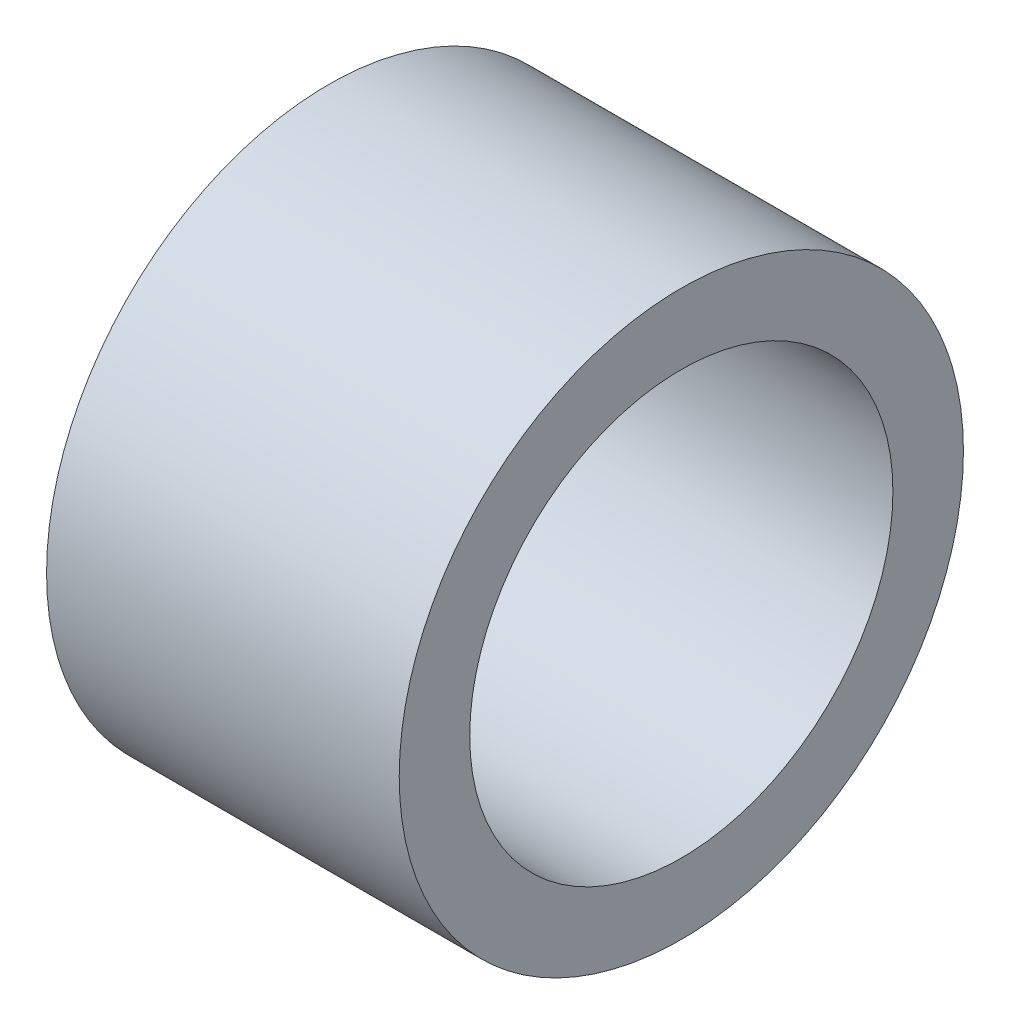
ISO-10303-21;
HEADER;
FILE_DESCRIPTION(('STEP AP214'),'2;1');
FILE_NAME('part.step','',(''),(''),'','','');
FILE_SCHEMA(('AUTOMOTIVE_DESIGN { 1 0 10303 214 1 1 1 1 }'));
ENDSEC;
DATA;
#1=APPLICATION_CONTEXT('core data for automotive mechanical design processes');
#2=APPLICATION_PROTOCOL_DEFINITION('international standard','automotive_design',2000,#1);
#3=PRODUCT_CONTEXT('',#1,'mechanical');
#4=PRODUCT('Part','Part','',(#3));
#5=PRODUCT_RELATED_PRODUCT_CATEGORY('part','',(#4));
#6=PRODUCT_DEFINITION_FORMATION('','',#4);
#7=PRODUCT_DEFINITION_CONTEXT('part definition',#1,'design');
#8=PRODUCT_DEFINITION('design','',#6,#7);
#9=PRODUCT_DEFINITION_SHAPE('','',#8);
#10=(LENGTH_UNIT() NAMED_UNIT(*) SI_UNIT(.MILLI.,.METRE.));
#11=(NAMED_UNIT(*) PLANE_ANGLE_UNIT() SI_UNIT($,.RADIAN.));
#12=(NAMED_UNIT(*) SI_UNIT($,.STERADIAN.) SOLID_ANGLE_UNIT());
#13=UNCERTAINTY_MEASURE_WITH_UNIT(LENGTH_MEASURE(1.E-05),#10,'distance_accuracy_value','');
#14=(GEOMETRIC_REPRESENTATION_CONTEXT(3) GLOBAL_UNCERTAINTY_ASSIGNED_CONTEXT((#13)) GLOBAL_UNIT_ASSIGNED_CONTEXT((#10,
#11,#12)) REPRESENTATION_CONTEXT('',''));
#15=CARTESIAN_POINT('',(0.,0.,0.));
#16=DIRECTION('',(0.,0.,1.));
#17=DIRECTION('',(1.,0.,0.));
#18=AXIS2_PLACEMENT_3D('',#15,#16,#17);
#19=CARTESIAN_POINT('',(10.,0.,0.));
#20=DIRECTION('',(1.,0.,0.));
#21=DIRECTION('',(0.,0.,-1.));
#22=AXIS2_PLACEMENT_3D('',#19,#20,#21);
#23=PLANE('',#22);
#24=CARTESIAN_POINT('',(10.,0.,0.));
#25=DIRECTION('',(1.,0.,0.));
#26=DIRECTION('',(0.,0.,-1.));
#27=AXIS2_PLACEMENT_3D('',#24,#25,#26);
#28=CIRCLE('',#27,16.);
#29=CARTESIAN_POINT('',(10.,0.,-16.));
#30=VERTEX_POINT('',#29);
#31=EDGE_CURVE('E10',#30,#30,#28,.T.);
#32=ORIENTED_EDGE('',*,*,#31,.T.);
#33=EDGE_LOOP('',(#32));
#34=FACE_BOUND('',#33,.T.);
#35=CARTESIAN_POINT('',(10.,0.,0.));
#36=DIRECTION('',(1.,0.,0.));
#37=DIRECTION('',(0.,0.,-1.));
#38=AXIS2_PLACEMENT_3D('',#35,#36,#37);
#39=CIRCLE('',#38,12.);
#40=CARTESIAN_POINT('',(10.,0.,-12.));
#41=VERTEX_POINT('',#40);
#42=EDGE_CURVE('E52',#41,#41,#39,.T.);
#43=ORIENTED_EDGE('',*,*,#42,.F.);
#44=EDGE_LOOP('',(#43));
#45=FACE_BOUND('',#44,.T.);
#46=ADVANCED_FACE('F37',(#34,#45),#23,.T.);
#47=CARTESIAN_POINT('',(-10.,0.,0.));
#48=DIRECTION('',(1.,0.,0.));
#49=DIRECTION('',(0.,0.,-1.));
#50=AXIS2_PLACEMENT_3D('',#47,#48,#49);
#51=PLANE('',#50);
#52=CARTESIAN_POINT('',(-10.,0.,0.));
#53=DIRECTION('',(1.,0.,0.));
#54=DIRECTION('',(0.,0.,-1.));
#55=AXIS2_PLACEMENT_3D('',#52,#53,#54);
#56=CIRCLE('',#55,16.);
#57=CARTESIAN_POINT('',(-10.,0.,-16.));
#58=VERTEX_POINT('',#57);
#59=EDGE_CURVE('E41',#58,#58,#56,.T.);
#60=ORIENTED_EDGE('',*,*,#59,.F.);
#61=EDGE_LOOP('',(#60));
#62=FACE_BOUND('',#61,.T.);
#63=CARTESIAN_POINT('',(-10.,0.,0.));
#64=DIRECTION('',(1.,0.,0.));
#65=DIRECTION('',(0.,0.,-1.));
#66=AXIS2_PLACEMENT_3D('',#63,#64,#65);
#67=CIRCLE('',#66,12.);
#68=CARTESIAN_POINT('',(-10.,0.,-12.));
#69=VERTEX_POINT('',#68);
#70=EDGE_CURVE('E54',#69,#69,#67,.T.);
#71=ORIENTED_EDGE('',*,*,#70,.T.);
#72=EDGE_LOOP('',(#71));
#73=FACE_BOUND('',#72,.T.);
#74=ADVANCED_FACE('F64',(#62,#73),#51,.F.);
#75=CARTESIAN_POINT('',(10.,0.,0.));
#76=DIRECTION('',(-1.,0.,0.));
#77=DIRECTION('',(0.,0.,1.));
#78=AXIS2_PLACEMENT_3D('',#75,#76,#77);
#79=CYLINDRICAL_SURFACE('',#78,12.);
#80=ORIENTED_EDGE('',*,*,#42,.T.);
#81=EDGE_LOOP('',(#80));
#82=FACE_BOUND('',#81,.T.);
#83=ORIENTED_EDGE('',*,*,#70,.F.);
#84=EDGE_LOOP('',(#83));
#85=FACE_BOUND('',#84,.T.);
#86=ADVANCED_FACE('F60',(#82,#85),#79,.F.);
#87=CARTESIAN_POINT('',(-17.78,0.,0.));
#88=DIRECTION('',(-1.,0.,0.));
#89=DIRECTION('',(0.,0.,1.));
#90=AXIS2_PLACEMENT_3D('',#87,#88,#89);
#91=CYLINDRICAL_SURFACE('',#90,16.);
#92=ORIENTED_EDGE('',*,*,#31,.F.);
#93=EDGE_LOOP('',(#92));
#94=FACE_BOUND('',#93,.T.);
#95=ORIENTED_EDGE('',*,*,#59,.T.);
#96=EDGE_LOOP('',(#95));
#97=FACE_BOUND('',#96,.T.);
#98=ADVANCED_FACE('F39',(#94,#97),#91,.T.);
#99=CLOSED_SHELL('',(#46,#74,#86,#98));
#100=MANIFOLD_SOLID_BREP('B2',#99);
#101=ADVANCED_BREP_SHAPE_REPRESENTATION('',(#18,#100),#14);
#102=SHAPE_DEFINITION_REPRESENTATION(#9,#101);
ENDSEC;
END-ISO-10303-21;
